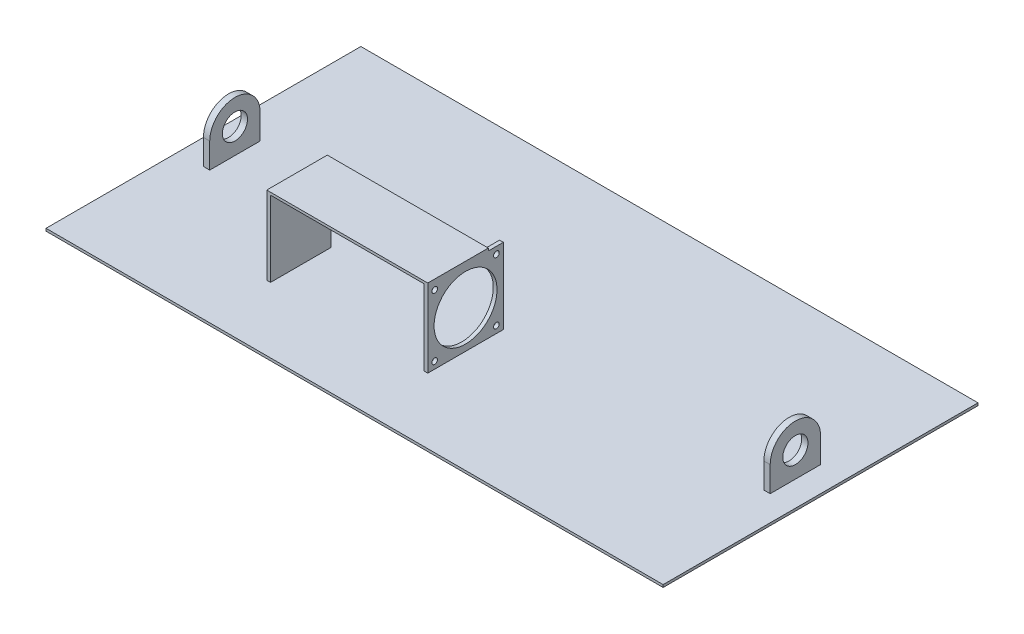
ISO-10303-21;
HEADER;
FILE_DESCRIPTION(('STEP AP214'),'2;1');
FILE_NAME('part.step','',(''),(''),'','','');
FILE_SCHEMA(('AUTOMOTIVE_DESIGN { 1 0 10303 214 1 1 1 1 }'));
ENDSEC;
DATA;
#1=APPLICATION_CONTEXT('core data for automotive mechanical design processes');
#2=APPLICATION_PROTOCOL_DEFINITION('international standard','automotive_design',2000,#1);
#3=PRODUCT_CONTEXT('',#1,'mechanical');
#4=PRODUCT('Part','Part','',(#3));
#5=PRODUCT_RELATED_PRODUCT_CATEGORY('part','',(#4));
#6=PRODUCT_DEFINITION_FORMATION('','',#4);
#7=PRODUCT_DEFINITION_CONTEXT('part definition',#1,'design');
#8=PRODUCT_DEFINITION('design','',#6,#7);
#9=PRODUCT_DEFINITION_SHAPE('','',#8);
#10=(LENGTH_UNIT() NAMED_UNIT(*) SI_UNIT(.MILLI.,.METRE.));
#11=(NAMED_UNIT(*) PLANE_ANGLE_UNIT() SI_UNIT($,.RADIAN.));
#12=(NAMED_UNIT(*) SI_UNIT($,.STERADIAN.) SOLID_ANGLE_UNIT());
#13=UNCERTAINTY_MEASURE_WITH_UNIT(LENGTH_MEASURE(1.E-05),#10,'distance_accuracy_value','');
#14=(GEOMETRIC_REPRESENTATION_CONTEXT(3) GLOBAL_UNCERTAINTY_ASSIGNED_CONTEXT((#13)) GLOBAL_UNIT_ASSIGNED_CONTEXT((#10,
#11,#12)) REPRESENTATION_CONTEXT('',''));
#15=CARTESIAN_POINT('',(0.,0.,0.));
#16=DIRECTION('',(0.,0.,1.));
#17=DIRECTION('',(1.,0.,0.));
#18=AXIS2_PLACEMENT_3D('',#15,#16,#17);
#19=CARTESIAN_POINT('',(0.,62.,0.));
#20=DIRECTION('',(0.,-1.,0.));
#21=DIRECTION('',(0.,0.,-1.));
#22=AXIS2_PLACEMENT_3D('',#19,#20,#21);
#23=PLANE('',#22);
#24=DIRECTION('',(-1.,0.,0.));
#25=VECTOR('',#24,1.);
#26=CARTESIAN_POINT('',(123.35,62.,-100.));
#27=LINE('',#26,#25);
#28=CARTESIAN_POINT('',(251.19,62.,-100.));
#29=VERTEX_POINT('',#28);
#30=CARTESIAN_POINT('',(248.19,62.,-100.));
#31=VERTEX_POINT('',#30);
#32=EDGE_CURVE('E88',#29,#31,#27,.T.);
#33=ORIENTED_EDGE('',*,*,#32,.F.);
#34=DIRECTION('',(0.,0.,-1.));
#35=VECTOR('',#34,1.);
#36=CARTESIAN_POINT('',(251.19,62.,-111.93));
#37=LINE('',#36,#35);
#38=CARTESIAN_POINT('',(251.19,62.,-111.93));
#39=VERTEX_POINT('',#38);
#40=EDGE_CURVE('E305',#29,#39,#37,.T.);
#41=ORIENTED_EDGE('',*,*,#40,.T.);
#42=DIRECTION('',(-1.,0.,0.));
#43=VECTOR('',#42,1.);
#44=CARTESIAN_POINT('',(248.19,62.,-111.93));
#45=LINE('',#44,#43);
#46=CARTESIAN_POINT('',(248.19,62.,-111.93));
#47=VERTEX_POINT('',#46);
#48=EDGE_CURVE('E308',#39,#47,#45,.T.);
#49=ORIENTED_EDGE('',*,*,#48,.T.);
#50=DIRECTION('',(0.,0.,1.));
#51=VECTOR('',#50,1.);
#52=CARTESIAN_POINT('',(248.19,62.,-111.93));
#53=LINE('',#52,#51);
#54=EDGE_CURVE('E303',#47,#31,#53,.T.);
#55=ORIENTED_EDGE('',*,*,#54,.T.);
#56=EDGE_LOOP('',(#33,#41,#49,#55));
#57=FACE_BOUND('',#56,.T.);
#58=ADVANCED_FACE('F72',(#57),#23,.F.);
#59=CARTESIAN_POINT('',(0.,2.,0.));
#60=DIRECTION('',(0.,1.,0.));
#61=DIRECTION('',(0.,0.,1.));
#62=AXIS2_PLACEMENT_3D('',#59,#60,#61);
#63=PLANE('',#62);
#64=DIRECTION('',(-1.,0.,0.));
#65=VECTOR('',#64,1.);
#66=CARTESIAN_POINT('',(20.0000000000001,2.,-105.));
#67=LINE('',#66,#65);
#68=CARTESIAN_POINT('',(25.0000000000001,2.,-105.));
#69=VERTEX_POINT('',#68);
#70=CARTESIAN_POINT('',(20.0000000000001,2.,-105.));
#71=VERTEX_POINT('',#70);
#72=EDGE_CURVE('E342',#69,#71,#67,.T.);
#73=ORIENTED_EDGE('',*,*,#72,.T.);
#74=DIRECTION('',(0.,0.,-1.));
#75=VECTOR('',#74,1.);
#76=CARTESIAN_POINT('',(20.0000000000001,2.,-145.));
#77=LINE('',#76,#75);
#78=CARTESIAN_POINT('',(20.0000000000001,2.,-145.));
#79=VERTEX_POINT('',#78);
#80=EDGE_CURVE('E351',#71,#79,#77,.T.);
#81=ORIENTED_EDGE('',*,*,#80,.T.);
#82=DIRECTION('',(1.,0.,0.));
#83=VECTOR('',#82,1.);
#84=CARTESIAN_POINT('',(20.0000000000001,2.,-145.));
#85=LINE('',#84,#83);
#86=CARTESIAN_POINT('',(25.0000000000001,2.,-145.));
#87=VERTEX_POINT('',#86);
#88=EDGE_CURVE('E348',#79,#87,#85,.T.);
#89=ORIENTED_EDGE('',*,*,#88,.T.);
#90=DIRECTION('',(0.,0.,1.));
#91=VECTOR('',#90,1.);
#92=CARTESIAN_POINT('',(25.0000000000001,2.,-145.));
#93=LINE('',#92,#91);
#94=EDGE_CURVE('E345',#87,#69,#93,.T.);
#95=ORIENTED_EDGE('',*,*,#94,.T.);
#96=EDGE_LOOP('',(#73,#81,#89,#95));
#97=FACE_BOUND('',#96,.T.);
#98=DIRECTION('',(0.,0.,1.));
#99=VECTOR('',#98,1.);
#100=CARTESIAN_POINT('',(0.,2.,-250.));
#101=LINE('',#100,#99);
#102=CARTESIAN_POINT('',(0.,2.,-250.));
#103=VERTEX_POINT('',#102);
#104=CARTESIAN_POINT('',(0.,2.,0.));
#105=VERTEX_POINT('',#104);
#106=EDGE_CURVE('E393',#103,#105,#101,.T.);
#107=ORIENTED_EDGE('',*,*,#106,.T.);
#108=DIRECTION('',(1.,0.,0.));
#109=VECTOR('',#108,1.);
#110=CARTESIAN_POINT('',(0.,2.,0.));
#111=LINE('',#110,#109);
#112=CARTESIAN_POINT('',(490.,2.,0.));
#113=VERTEX_POINT('',#112);
#114=EDGE_CURVE('E396',#105,#113,#111,.T.);
#115=ORIENTED_EDGE('',*,*,#114,.T.);
#116=DIRECTION('',(0.,0.,-1.));
#117=VECTOR('',#116,1.);
#118=CARTESIAN_POINT('',(490.,2.,0.));
#119=LINE('',#118,#117);
#120=CARTESIAN_POINT('',(490.,2.,-250.));
#121=VERTEX_POINT('',#120);
#122=EDGE_CURVE('E399',#113,#121,#119,.T.);
#123=ORIENTED_EDGE('',*,*,#122,.T.);
#124=DIRECTION('',(-1.,0.,0.));
#125=VECTOR('',#124,1.);
#126=CARTESIAN_POINT('',(490.,2.,-250.));
#127=LINE('',#126,#125);
#128=EDGE_CURVE('E401',#121,#103,#127,.T.);
#129=ORIENTED_EDGE('',*,*,#128,.T.);
#130=EDGE_LOOP('',(#107,#115,#123,#129));
#131=FACE_BOUND('',#130,.T.);
#132=DIRECTION('',(0.,0.,-1.));
#133=VECTOR('',#132,1.);
#134=CARTESIAN_POINT('',(470.,2.,-145.));
#135=LINE('',#134,#133);
#136=CARTESIAN_POINT('',(470.,2.,-105.));
#137=VERTEX_POINT('',#136);
#138=CARTESIAN_POINT('',(470.,2.,-145.));
#139=VERTEX_POINT('',#138);
#140=EDGE_CURVE('E375',#137,#139,#135,.T.);
#141=ORIENTED_EDGE('',*,*,#140,.F.);
#142=DIRECTION('',(1.,0.,0.));
#143=VECTOR('',#142,1.);
#144=CARTESIAN_POINT('',(470.,2.,-105.));
#145=LINE('',#144,#143);
#146=CARTESIAN_POINT('',(465.,2.,-105.));
#147=VERTEX_POINT('',#146);
#148=EDGE_CURVE('E372',#147,#137,#145,.T.);
#149=ORIENTED_EDGE('',*,*,#148,.F.);
#150=DIRECTION('',(0.,0.,1.));
#151=VECTOR('',#150,1.);
#152=CARTESIAN_POINT('',(465.,2.,-145.));
#153=LINE('',#152,#151);
#154=CARTESIAN_POINT('',(465.,2.,-145.));
#155=VERTEX_POINT('',#154);
#156=EDGE_CURVE('E381',#155,#147,#153,.T.);
#157=ORIENTED_EDGE('',*,*,#156,.F.);
#158=DIRECTION('',(-1.,0.,0.));
#159=VECTOR('',#158,1.);
#160=CARTESIAN_POINT('',(470.,2.,-145.));
#161=LINE('',#160,#159);
#162=EDGE_CURVE('E378',#139,#155,#161,.T.);
#163=ORIENTED_EDGE('',*,*,#162,.F.);
#164=EDGE_LOOP('',(#141,#149,#157,#163));
#165=FACE_BOUND('',#164,.T.);
#166=DIRECTION('',(1.,0.,0.));
#167=VECTOR('',#166,1.);
#168=CARTESIAN_POINT('',(251.19,2.,-51.93));
#169=LINE('',#168,#167);
#170=CARTESIAN_POINT('',(248.19,2.,-51.93));
#171=VERTEX_POINT('',#170);
#172=CARTESIAN_POINT('',(251.19,2.,-51.93));
#173=VERTEX_POINT('',#172);
#174=EDGE_CURVE('E313',#171,#173,#169,.T.);
#175=ORIENTED_EDGE('',*,*,#174,.F.);
#176=DIRECTION('',(0.,0.,1.));
#177=VECTOR('',#176,1.);
#178=CARTESIAN_POINT('',(248.19,2.,-111.93));
#179=LINE('',#178,#177);
#180=CARTESIAN_POINT('',(248.19,2.,-111.93));
#181=VERTEX_POINT('',#180);
#182=EDGE_CURVE('E300',#181,#171,#179,.T.);
#183=ORIENTED_EDGE('',*,*,#182,.F.);
#184=DIRECTION('',(-1.,0.,0.));
#185=VECTOR('',#184,1.);
#186=CARTESIAN_POINT('',(248.19,2.,-111.93));
#187=LINE('',#186,#185);
#188=CARTESIAN_POINT('',(251.19,2.,-111.93));
#189=VERTEX_POINT('',#188);
#190=EDGE_CURVE('E306',#189,#181,#187,.T.);
#191=ORIENTED_EDGE('',*,*,#190,.F.);
#192=DIRECTION('',(0.,0.,-1.));
#193=VECTOR('',#192,1.);
#194=CARTESIAN_POINT('',(251.19,2.,-111.93));
#195=LINE('',#194,#193);
#196=EDGE_CURVE('E315',#173,#189,#195,.T.);
#197=ORIENTED_EDGE('',*,*,#196,.F.);
#198=EDGE_LOOP('',(#175,#183,#191,#197));
#199=FACE_BOUND('',#198,.T.);
#200=DIRECTION('',(1.,0.,0.));
#201=VECTOR('',#200,1.);
#202=CARTESIAN_POINT('',(126.35,2.,-51.93));
#203=LINE('',#202,#201);
#204=CARTESIAN_POINT('',(123.35,2.,-51.93));
#205=VERTEX_POINT('',#204);
#206=CARTESIAN_POINT('',(126.35,2.,-51.93));
#207=VERTEX_POINT('',#206);
#208=EDGE_CURVE('E264',#205,#207,#203,.T.);
#209=ORIENTED_EDGE('',*,*,#208,.F.);
#210=DIRECTION('',(0.,0.,1.));
#211=VECTOR('',#210,1.);
#212=CARTESIAN_POINT('',(123.35,2.,-51.93));
#213=LINE('',#212,#211);
#214=CARTESIAN_POINT('',(123.35,2.,-100.));
#215=VERTEX_POINT('',#214);
#216=EDGE_CURVE('E226',#215,#205,#213,.T.);
#217=ORIENTED_EDGE('',*,*,#216,.F.);
#218=DIRECTION('',(-1.,0.,0.));
#219=VECTOR('',#218,1.);
#220=CARTESIAN_POINT('',(123.35,2.,-100.));
#221=LINE('',#220,#219);
#222=CARTESIAN_POINT('',(126.35,2.,-100.));
#223=VERTEX_POINT('',#222);
#224=EDGE_CURVE('E262',#223,#215,#221,.T.);
#225=ORIENTED_EDGE('',*,*,#224,.F.);
#226=DIRECTION('',(0.,0.,-1.));
#227=VECTOR('',#226,1.);
#228=CARTESIAN_POINT('',(126.35,2.,-100.));
#229=LINE('',#228,#227);
#230=EDGE_CURVE('E266',#207,#223,#229,.T.);
#231=ORIENTED_EDGE('',*,*,#230,.F.);
#232=EDGE_LOOP('',(#209,#217,#225,#231));
#233=FACE_BOUND('',#232,.T.);
#234=ADVANCED_FACE('F440',(#97,#131,#165,#199,#233),#63,.T.);
#235=CARTESIAN_POINT('',(20.0000000000001,42.,-145.));
#236=DIRECTION('',(0.,0.,-1.));
#237=DIRECTION('',(-1.,0.,0.));
#238=AXIS2_PLACEMENT_3D('',#235,#236,#237);
#239=PLANE('',#238);
#240=DIRECTION('',(0.,-1.,0.));
#241=VECTOR('',#240,1.);
#242=CARTESIAN_POINT('',(20.0000000000001,42.,-145.));
#243=LINE('',#242,#241);
#244=CARTESIAN_POINT('',(20.0000000000001,22.,-145.));
#245=VERTEX_POINT('',#244);
#246=EDGE_CURVE('E356',#245,#79,#243,.T.);
#247=ORIENTED_EDGE('',*,*,#246,.F.);
#248=DIRECTION('',(-1.,0.,0.));
#249=VECTOR('',#248,1.);
#250=CARTESIAN_POINT('',(60.0000000000001,22.,-145.));
#251=LINE('',#250,#249);
#252=CARTESIAN_POINT('',(25.0000000000001,22.,-145.));
#253=VERTEX_POINT('',#252);
#254=EDGE_CURVE('E332',#253,#245,#251,.T.);
#255=ORIENTED_EDGE('',*,*,#254,.F.);
#256=DIRECTION('',(0.,-1.,0.));
#257=VECTOR('',#256,1.);
#258=CARTESIAN_POINT('',(25.0000000000001,42.,-145.));
#259=LINE('',#258,#257);
#260=EDGE_CURVE('E358',#253,#87,#259,.T.);
#261=ORIENTED_EDGE('',*,*,#260,.T.);
#262=ORIENTED_EDGE('',*,*,#88,.F.);
#263=EDGE_LOOP('',(#247,#255,#261,#262));
#264=FACE_BOUND('',#263,.T.);
#265=ADVANCED_FACE('F443',(#264),#239,.T.);
#266=CARTESIAN_POINT('',(470.,42.,-145.));
#267=DIRECTION('',(-1.,0.,0.));
#268=DIRECTION('',(0.,0.,1.));
#269=AXIS2_PLACEMENT_3D('',#266,#267,#268);
#270=PLANE('',#269);
#271=CARTESIAN_POINT('',(470.,22.,-125.));
#272=DIRECTION('',(1.,0.,0.));
#273=DIRECTION('',(0.,0.,-1.));
#274=AXIS2_PLACEMENT_3D('',#271,#272,#273);
#275=CIRCLE('',#274,9.99999999999997);
#276=CARTESIAN_POINT('',(470.,22.,-135.));
#277=VERTEX_POINT('',#276);
#278=EDGE_CURVE('E362',#277,#277,#275,.T.);
#279=ORIENTED_EDGE('',*,*,#278,.F.);
#280=EDGE_LOOP('',(#279));
#281=FACE_BOUND('',#280,.T.);
#282=DIRECTION('',(0.,-1.,0.));
#283=VECTOR('',#282,1.);
#284=CARTESIAN_POINT('',(470.,42.,-145.));
#285=LINE('',#284,#283);
#286=CARTESIAN_POINT('',(470.,22.,-145.));
#287=VERTEX_POINT('',#286);
#288=EDGE_CURVE('E388',#287,#139,#285,.T.);
#289=ORIENTED_EDGE('',*,*,#288,.F.);
#290=CARTESIAN_POINT('',(470.,22.,-125.));
#291=DIRECTION('',(1.,0.,0.));
#292=DIRECTION('',(0.,0.,-1.));
#293=AXIS2_PLACEMENT_3D('',#290,#291,#292);
#294=CIRCLE('',#293,20.);
#295=CARTESIAN_POINT('',(470.,22.,-105.));
#296=VERTEX_POINT('',#295);
#297=EDGE_CURVE('E365',#287,#296,#294,.T.);
#298=ORIENTED_EDGE('',*,*,#297,.T.);
#299=DIRECTION('',(0.,-1.,0.));
#300=VECTOR('',#299,1.);
#301=CARTESIAN_POINT('',(470.,42.,-105.));
#302=LINE('',#301,#300);
#303=EDGE_CURVE('E390',#296,#137,#302,.T.);
#304=ORIENTED_EDGE('',*,*,#303,.T.);
#305=ORIENTED_EDGE('',*,*,#140,.T.);
#306=EDGE_LOOP('',(#289,#298,#304,#305));
#307=FACE_BOUND('',#306,.T.);
#308=ADVANCED_FACE('F520',(#281,#307),#270,.F.);
#309=CARTESIAN_POINT('',(465.,42.,-145.));
#310=DIRECTION('',(1.,0.,0.));
#311=DIRECTION('',(0.,0.,-1.));
#312=AXIS2_PLACEMENT_3D('',#309,#310,#311);
#313=PLANE('',#312);
#314=CARTESIAN_POINT('',(465.,22.,-125.));
#315=DIRECTION('',(1.,0.,0.));
#316=DIRECTION('',(0.,0.,-1.));
#317=AXIS2_PLACEMENT_3D('',#314,#315,#316);
#318=CIRCLE('',#317,9.99999999999997);
#319=CARTESIAN_POINT('',(465.,22.,-135.));
#320=VERTEX_POINT('',#319);
#321=EDGE_CURVE('E76',#320,#320,#318,.T.);
#322=ORIENTED_EDGE('',*,*,#321,.T.);
#323=EDGE_LOOP('',(#322));
#324=FACE_BOUND('',#323,.T.);
#325=CARTESIAN_POINT('',(465.,22.,-125.));
#326=DIRECTION('',(1.,0.,0.));
#327=DIRECTION('',(0.,0.,-1.));
#328=AXIS2_PLACEMENT_3D('',#325,#326,#327);
#329=CIRCLE('',#328,20.);
#330=CARTESIAN_POINT('',(465.,22.,-145.));
#331=VERTEX_POINT('',#330);
#332=CARTESIAN_POINT('',(465.,22.,-105.));
#333=VERTEX_POINT('',#332);
#334=EDGE_CURVE('E370',#331,#333,#329,.T.);
#335=ORIENTED_EDGE('',*,*,#334,.F.);
#336=DIRECTION('',(0.,-1.,0.));
#337=VECTOR('',#336,1.);
#338=CARTESIAN_POINT('',(465.,42.,-145.));
#339=LINE('',#338,#337);
#340=EDGE_CURVE('E386',#331,#155,#339,.T.);
#341=ORIENTED_EDGE('',*,*,#340,.T.);
#342=ORIENTED_EDGE('',*,*,#156,.T.);
#343=DIRECTION('',(0.,-1.,0.));
#344=VECTOR('',#343,1.);
#345=CARTESIAN_POINT('',(465.,42.,-105.));
#346=LINE('',#345,#344);
#347=EDGE_CURVE('E384',#333,#147,#346,.T.);
#348=ORIENTED_EDGE('',*,*,#347,.F.);
#349=EDGE_LOOP('',(#335,#341,#342,#348));
#350=FACE_BOUND('',#349,.T.);
#351=ADVANCED_FACE('F538',(#324,#350),#313,.F.);
#352=CARTESIAN_POINT('',(470.,42.,-105.));
#353=DIRECTION('',(0.,0.,-1.));
#354=DIRECTION('',(-1.,0.,0.));
#355=AXIS2_PLACEMENT_3D('',#352,#353,#354);
#356=PLANE('',#355);
#357=DIRECTION('',(1.,0.,0.));
#358=VECTOR('',#357,1.);
#359=CARTESIAN_POINT('',(430.,22.,-105.));
#360=LINE('',#359,#358);
#361=EDGE_CURVE('E368',#333,#296,#360,.T.);
#362=ORIENTED_EDGE('',*,*,#361,.F.);
#363=ORIENTED_EDGE('',*,*,#347,.T.);
#364=ORIENTED_EDGE('',*,*,#148,.T.);
#365=ORIENTED_EDGE('',*,*,#303,.F.);
#366=EDGE_LOOP('',(#362,#363,#364,#365));
#367=FACE_BOUND('',#366,.T.);
#368=ADVANCED_FACE('F541',(#367),#356,.F.);
#369=CARTESIAN_POINT('',(0.,2.,-250.));
#370=DIRECTION('',(1.,0.,0.));
#371=DIRECTION('',(0.,0.,-1.));
#372=AXIS2_PLACEMENT_3D('',#369,#370,#371);
#373=PLANE('',#372);
#374=DIRECTION('',(0.,0.,1.));
#375=VECTOR('',#374,1.);
#376=CARTESIAN_POINT('',(0.,0.,-250.));
#377=LINE('',#376,#375);
#378=CARTESIAN_POINT('',(0.,0.,-250.));
#379=VERTEX_POINT('',#378);
#380=CARTESIAN_POINT('',(0.,0.,0.));
#381=VERTEX_POINT('',#380);
#382=EDGE_CURVE('E392',#379,#381,#377,.T.);
#383=ORIENTED_EDGE('',*,*,#382,.T.);
#384=DIRECTION('',(0.,-1.,0.));
#385=VECTOR('',#384,1.);
#386=CARTESIAN_POINT('',(0.,2.,0.));
#387=LINE('',#386,#385);
#388=EDGE_CURVE('E81',#105,#381,#387,.T.);
#389=ORIENTED_EDGE('',*,*,#388,.F.);
#390=ORIENTED_EDGE('',*,*,#106,.F.);
#391=DIRECTION('',(0.,-1.,0.));
#392=VECTOR('',#391,1.);
#393=CARTESIAN_POINT('',(0.,2.,-250.));
#394=LINE('',#393,#392);
#395=EDGE_CURVE('E403',#103,#379,#394,.T.);
#396=ORIENTED_EDGE('',*,*,#395,.T.);
#397=EDGE_LOOP('',(#383,#389,#390,#396));
#398=FACE_BOUND('',#397,.T.);
#399=ADVANCED_FACE('F74',(#398),#373,.F.);
#400=CARTESIAN_POINT('',(0.,2.,0.));
#401=DIRECTION('',(0.,0.,-1.));
#402=DIRECTION('',(-1.,0.,0.));
#403=AXIS2_PLACEMENT_3D('',#400,#401,#402);
#404=PLANE('',#403);
#405=DIRECTION('',(1.,0.,0.));
#406=VECTOR('',#405,1.);
#407=CARTESIAN_POINT('',(0.,0.,0.));
#408=LINE('',#407,#406);
#409=CARTESIAN_POINT('',(490.,0.,0.));
#410=VERTEX_POINT('',#409);
#411=EDGE_CURVE('E406',#381,#410,#408,.T.);
#412=ORIENTED_EDGE('',*,*,#411,.T.);
#413=DIRECTION('',(0.,-1.,0.));
#414=VECTOR('',#413,1.);
#415=CARTESIAN_POINT('',(490.,2.,0.));
#416=LINE('',#415,#414);
#417=EDGE_CURVE('E416',#113,#410,#416,.T.);
#418=ORIENTED_EDGE('',*,*,#417,.F.);
#419=ORIENTED_EDGE('',*,*,#114,.F.);
#420=ORIENTED_EDGE('',*,*,#388,.T.);
#421=EDGE_LOOP('',(#412,#418,#419,#420));
#422=FACE_BOUND('',#421,.T.);
#423=ADVANCED_FACE('F422',(#422),#404,.F.);
#424=CARTESIAN_POINT('',(490.,2.,0.));
#425=DIRECTION('',(-1.,0.,0.));
#426=DIRECTION('',(0.,0.,1.));
#427=AXIS2_PLACEMENT_3D('',#424,#425,#426);
#428=PLANE('',#427);
#429=DIRECTION('',(0.,0.,-1.));
#430=VECTOR('',#429,1.);
#431=CARTESIAN_POINT('',(490.,0.,0.));
#432=LINE('',#431,#430);
#433=CARTESIAN_POINT('',(490.,0.,-250.));
#434=VERTEX_POINT('',#433);
#435=EDGE_CURVE('E408',#410,#434,#432,.T.);
#436=ORIENTED_EDGE('',*,*,#435,.T.);
#437=DIRECTION('',(0.,-1.,0.));
#438=VECTOR('',#437,1.);
#439=CARTESIAN_POINT('',(490.,2.,-250.));
#440=LINE('',#439,#438);
#441=EDGE_CURVE('E413',#121,#434,#440,.T.);
#442=ORIENTED_EDGE('',*,*,#441,.F.);
#443=ORIENTED_EDGE('',*,*,#122,.F.);
#444=ORIENTED_EDGE('',*,*,#417,.T.);
#445=EDGE_LOOP('',(#436,#442,#443,#444));
#446=FACE_BOUND('',#445,.T.);
#447=ADVANCED_FACE('F434',(#446),#428,.F.);
#448=CARTESIAN_POINT('',(490.,2.,-250.));
#449=DIRECTION('',(0.,0.,1.));
#450=DIRECTION('',(1.,0.,0.));
#451=AXIS2_PLACEMENT_3D('',#448,#449,#450);
#452=PLANE('',#451);
#453=DIRECTION('',(-1.,0.,0.));
#454=VECTOR('',#453,1.);
#455=CARTESIAN_POINT('',(490.,0.,-250.));
#456=LINE('',#455,#454);
#457=EDGE_CURVE('E397',#434,#379,#456,.T.);
#458=ORIENTED_EDGE('',*,*,#457,.T.);
#459=ORIENTED_EDGE('',*,*,#395,.F.);
#460=ORIENTED_EDGE('',*,*,#128,.F.);
#461=ORIENTED_EDGE('',*,*,#441,.T.);
#462=EDGE_LOOP('',(#458,#459,#460,#461));
#463=FACE_BOUND('',#462,.T.);
#464=ADVANCED_FACE('F438',(#463),#452,.F.);
#465=CARTESIAN_POINT('',(0.,0.,0.));
#466=DIRECTION('',(0.,1.,0.));
#467=DIRECTION('',(0.,0.,1.));
#468=AXIS2_PLACEMENT_3D('',#465,#466,#467);
#469=PLANE('',#468);
#470=ORIENTED_EDGE('',*,*,#382,.F.);
#471=ORIENTED_EDGE('',*,*,#457,.F.);
#472=ORIENTED_EDGE('',*,*,#435,.F.);
#473=ORIENTED_EDGE('',*,*,#411,.F.);
#474=EDGE_LOOP('',(#470,#471,#472,#473));
#475=FACE_BOUND('',#474,.T.);
#476=ADVANCED_FACE('F430',(#475),#469,.F.);
#477=CARTESIAN_POINT('',(470.,42.,-145.));
#478=DIRECTION('',(0.,0.,1.));
#479=DIRECTION('',(1.,0.,0.));
#480=AXIS2_PLACEMENT_3D('',#477,#478,#479);
#481=PLANE('',#480);
#482=ORIENTED_EDGE('',*,*,#340,.F.);
#483=DIRECTION('',(1.,0.,0.));
#484=VECTOR('',#483,1.);
#485=CARTESIAN_POINT('',(430.,22.,-145.));
#486=LINE('',#485,#484);
#487=EDGE_CURVE('E12',#331,#287,#486,.T.);
#488=ORIENTED_EDGE('',*,*,#487,.T.);
#489=ORIENTED_EDGE('',*,*,#288,.T.);
#490=ORIENTED_EDGE('',*,*,#162,.T.);
#491=EDGE_LOOP('',(#482,#488,#489,#490));
#492=FACE_BOUND('',#491,.T.);
#493=ADVANCED_FACE('F536',(#492),#481,.F.);
#494=CARTESIAN_POINT('',(430.,22.,-125.));
#495=DIRECTION('',(1.,0.,0.));
#496=DIRECTION('',(0.,0.,-1.));
#497=AXIS2_PLACEMENT_3D('',#494,#495,#496);
#498=CYLINDRICAL_SURFACE('',#497,20.);
#499=ORIENTED_EDGE('',*,*,#334,.T.);
#500=ORIENTED_EDGE('',*,*,#361,.T.);
#501=ORIENTED_EDGE('',*,*,#297,.F.);
#502=ORIENTED_EDGE('',*,*,#487,.F.);
#503=EDGE_LOOP('',(#499,#500,#501,#502));
#504=FACE_BOUND('',#503,.T.);
#505=ADVANCED_FACE('F532',(#504),#498,.T.);
#506=CARTESIAN_POINT('',(430.,22.,-125.));
#507=DIRECTION('',(1.,0.,0.));
#508=DIRECTION('',(0.,0.,-1.));
#509=AXIS2_PLACEMENT_3D('',#506,#507,#508);
#510=CYLINDRICAL_SURFACE('',#509,9.99999999999997);
#511=ORIENTED_EDGE('',*,*,#278,.T.);
#512=EDGE_LOOP('',(#511));
#513=FACE_BOUND('',#512,.T.);
#514=ORIENTED_EDGE('',*,*,#321,.F.);
#515=EDGE_LOOP('',(#514));
#516=FACE_BOUND('',#515,.T.);
#517=ADVANCED_FACE('F528',(#513,#516),#510,.F.);
#518=CARTESIAN_POINT('',(20.0000000000001,42.,-105.));
#519=DIRECTION('',(0.,0.,1.));
#520=DIRECTION('',(1.,0.,0.));
#521=AXIS2_PLACEMENT_3D('',#518,#519,#520);
#522=PLANE('',#521);
#523=DIRECTION('',(-1.,0.,0.));
#524=VECTOR('',#523,1.);
#525=CARTESIAN_POINT('',(60.0000000000001,22.,-105.));
#526=LINE('',#525,#524);
#527=CARTESIAN_POINT('',(25.0000000000001,22.,-105.));
#528=VERTEX_POINT('',#527);
#529=CARTESIAN_POINT('',(20.0000000000001,22.,-105.));
#530=VERTEX_POINT('',#529);
#531=EDGE_CURVE('E337',#528,#530,#526,.T.);
#532=ORIENTED_EDGE('',*,*,#531,.T.);
#533=DIRECTION('',(0.,-1.,0.));
#534=VECTOR('',#533,1.);
#535=CARTESIAN_POINT('',(20.0000000000001,42.,-105.));
#536=LINE('',#535,#534);
#537=EDGE_CURVE('E354',#530,#71,#536,.T.);
#538=ORIENTED_EDGE('',*,*,#537,.T.);
#539=ORIENTED_EDGE('',*,*,#72,.F.);
#540=DIRECTION('',(0.,-1.,0.));
#541=VECTOR('',#540,1.);
#542=CARTESIAN_POINT('',(25.0000000000001,42.,-105.));
#543=LINE('',#542,#541);
#544=EDGE_CURVE('E360',#528,#69,#543,.T.);
#545=ORIENTED_EDGE('',*,*,#544,.F.);
#546=EDGE_LOOP('',(#532,#538,#539,#545));
#547=FACE_BOUND('',#546,.T.);
#548=ADVANCED_FACE('F524',(#547),#522,.T.);
#549=CARTESIAN_POINT('',(25.0000000000001,42.,-145.));
#550=DIRECTION('',(1.,0.,0.));
#551=DIRECTION('',(0.,0.,-1.));
#552=AXIS2_PLACEMENT_3D('',#549,#550,#551);
#553=PLANE('',#552);
#554=CARTESIAN_POINT('',(25.0000000000001,22.,-125.));
#555=DIRECTION('',(1.,0.,0.));
#556=DIRECTION('',(0.,0.,-1.));
#557=AXIS2_PLACEMENT_3D('',#554,#555,#556);
#558=CIRCLE('',#557,9.99999999999997);
#559=CARTESIAN_POINT('',(25.0000000000001,22.,-135.));
#560=VERTEX_POINT('',#559);
#561=EDGE_CURVE('E329',#560,#560,#558,.F.);
#562=ORIENTED_EDGE('',*,*,#561,.T.);
#563=EDGE_LOOP('',(#562));
#564=FACE_BOUND('',#563,.T.);
#565=ORIENTED_EDGE('',*,*,#260,.F.);
#566=CARTESIAN_POINT('',(25.0000000000001,22.,-125.));
#567=DIRECTION('',(1.,0.,0.));
#568=DIRECTION('',(0.,0.,-1.));
#569=AXIS2_PLACEMENT_3D('',#566,#567,#568);
#570=CIRCLE('',#569,20.);
#571=EDGE_CURVE('E340',#528,#253,#570,.F.);
#572=ORIENTED_EDGE('',*,*,#571,.F.);
#573=ORIENTED_EDGE('',*,*,#544,.T.);
#574=ORIENTED_EDGE('',*,*,#94,.F.);
#575=EDGE_LOOP('',(#565,#572,#573,#574));
#576=FACE_BOUND('',#575,.T.);
#577=ADVANCED_FACE('F516',(#564,#576),#553,.T.);
#578=CARTESIAN_POINT('',(20.0000000000001,42.,-145.));
#579=DIRECTION('',(-1.,0.,0.));
#580=DIRECTION('',(0.,0.,1.));
#581=AXIS2_PLACEMENT_3D('',#578,#579,#580);
#582=PLANE('',#581);
#583=CARTESIAN_POINT('',(20.0000000000001,22.,-125.));
#584=DIRECTION('',(1.,0.,0.));
#585=DIRECTION('',(0.,0.,-1.));
#586=AXIS2_PLACEMENT_3D('',#583,#584,#585);
#587=CIRCLE('',#586,9.99999999999997);
#588=CARTESIAN_POINT('',(20.0000000000001,22.,-135.));
#589=VERTEX_POINT('',#588);
#590=EDGE_CURVE('E326',#589,#589,#587,.T.);
#591=ORIENTED_EDGE('',*,*,#590,.T.);
#592=EDGE_LOOP('',(#591));
#593=FACE_BOUND('',#592,.T.);
#594=CARTESIAN_POINT('',(20.0000000000001,22.,-125.));
#595=DIRECTION('',(1.,0.,0.));
#596=DIRECTION('',(0.,0.,-1.));
#597=AXIS2_PLACEMENT_3D('',#594,#595,#596);
#598=CIRCLE('',#597,20.);
#599=EDGE_CURVE('E335',#245,#530,#598,.T.);
#600=ORIENTED_EDGE('',*,*,#599,.F.);
#601=ORIENTED_EDGE('',*,*,#246,.T.);
#602=ORIENTED_EDGE('',*,*,#80,.F.);
#603=ORIENTED_EDGE('',*,*,#537,.F.);
#604=EDGE_LOOP('',(#600,#601,#602,#603));
#605=FACE_BOUND('',#604,.T.);
#606=ADVANCED_FACE('F512',(#593,#605),#582,.T.);
#607=CARTESIAN_POINT('',(60.0000000000001,22.,-125.));
#608=DIRECTION('',(-1.,0.,0.));
#609=DIRECTION('',(0.,0.,1.));
#610=AXIS2_PLACEMENT_3D('',#607,#608,#609);
#611=CYLINDRICAL_SURFACE('',#610,20.);
#612=ORIENTED_EDGE('',*,*,#571,.T.);
#613=ORIENTED_EDGE('',*,*,#254,.T.);
#614=ORIENTED_EDGE('',*,*,#599,.T.);
#615=ORIENTED_EDGE('',*,*,#531,.F.);
#616=EDGE_LOOP('',(#612,#613,#614,#615));
#617=FACE_BOUND('',#616,.T.);
#618=ADVANCED_FACE('F508',(#617),#611,.T.);
#619=CARTESIAN_POINT('',(60.0000000000001,22.,-125.));
#620=DIRECTION('',(-1.,0.,0.));
#621=DIRECTION('',(0.,0.,1.));
#622=AXIS2_PLACEMENT_3D('',#619,#620,#621);
#623=CYLINDRICAL_SURFACE('',#622,9.99999999999997);
#624=ORIENTED_EDGE('',*,*,#561,.F.);
#625=EDGE_LOOP('',(#624));
#626=FACE_BOUND('',#625,.T.);
#627=ORIENTED_EDGE('',*,*,#590,.F.);
#628=EDGE_LOOP('',(#627));
#629=FACE_BOUND('',#628,.T.);
#630=ADVANCED_FACE('F504',(#626,#629),#623,.F.);
#631=CARTESIAN_POINT('',(248.19,62.,-111.93));
#632=DIRECTION('',(1.,0.,0.));
#633=DIRECTION('',(0.,0.,-1.));
#634=AXIS2_PLACEMENT_3D('',#631,#632,#633);
#635=PLANE('',#634);
#636=CARTESIAN_POINT('',(248.19,56.5,-106.43));
#637=DIRECTION('',(-1.,0.,0.));
#638=DIRECTION('',(0.,0.,-1.));
#639=AXIS2_PLACEMENT_3D('',#636,#637,#638);
#640=CIRCLE('',#639,2.25000000000001);
#641=CARTESIAN_POINT('',(248.19,56.5,-108.68));
#642=VERTEX_POINT('',#641);
#643=EDGE_CURVE('E229',#642,#642,#640,.T.);
#644=ORIENTED_EDGE('',*,*,#643,.F.);
#645=EDGE_LOOP('',(#644));
#646=FACE_BOUND('',#645,.T.);
#647=CARTESIAN_POINT('',(248.19,7.50000000000005,-106.43));
#648=DIRECTION('',(-1.,0.,0.));
#649=DIRECTION('',(0.,0.,1.));
#650=AXIS2_PLACEMENT_3D('',#647,#648,#649);
#651=CIRCLE('',#650,2.25000000000001);
#652=CARTESIAN_POINT('',(248.19,7.50000000000005,-104.18));
#653=VERTEX_POINT('',#652);
#654=EDGE_CURVE('E281',#653,#653,#651,.T.);
#655=ORIENTED_EDGE('',*,*,#654,.F.);
#656=EDGE_LOOP('',(#655));
#657=FACE_BOUND('',#656,.T.);
#658=CARTESIAN_POINT('',(248.19,7.49999999999999,-57.43));
#659=DIRECTION('',(-1.,0.,0.));
#660=DIRECTION('',(0.,0.,-1.));
#661=AXIS2_PLACEMENT_3D('',#658,#659,#660);
#662=CIRCLE('',#661,2.25);
#663=CARTESIAN_POINT('',(248.19,7.49999999999999,-59.68));
#664=VERTEX_POINT('',#663);
#665=EDGE_CURVE('E273',#664,#664,#662,.T.);
#666=ORIENTED_EDGE('',*,*,#665,.F.);
#667=EDGE_LOOP('',(#666));
#668=FACE_BOUND('',#667,.T.);
#669=CARTESIAN_POINT('',(248.19,56.5,-57.43));
#670=DIRECTION('',(-1.,0.,0.));
#671=DIRECTION('',(0.,0.,1.));
#672=AXIS2_PLACEMENT_3D('',#669,#670,#671);
#673=CIRCLE('',#672,2.25);
#674=CARTESIAN_POINT('',(248.19,56.5,-55.18));
#675=VERTEX_POINT('',#674);
#676=EDGE_CURVE('E280',#675,#675,#673,.T.);
#677=ORIENTED_EDGE('',*,*,#676,.F.);
#678=EDGE_LOOP('',(#677));
#679=FACE_BOUND('',#678,.T.);
#680=CARTESIAN_POINT('',(248.19,32.,-81.93));
#681=DIRECTION('',(-1.,0.,0.));
#682=DIRECTION('',(0.,0.,1.));
#683=AXIS2_PLACEMENT_3D('',#680,#681,#682);
#684=CIRCLE('',#683,25.);
#685=CARTESIAN_POINT('',(248.19,32.,-56.93));
#686=VERTEX_POINT('',#685);
#687=EDGE_CURVE('E296',#686,#686,#684,.T.);
#688=ORIENTED_EDGE('',*,*,#687,.F.);
#689=EDGE_LOOP('',(#688));
#690=FACE_BOUND('',#689,.T.);
#691=ORIENTED_EDGE('',*,*,#182,.T.);
#692=DIRECTION('',(0.,-1.,0.));
#693=VECTOR('',#692,1.);
#694=CARTESIAN_POINT('',(248.19,62.,-51.93));
#695=LINE('',#694,#693);
#696=CARTESIAN_POINT('',(248.19,62.,-51.93));
#697=VERTEX_POINT('',#696);
#698=EDGE_CURVE('E324',#697,#171,#695,.T.);
#699=ORIENTED_EDGE('',*,*,#698,.F.);
#700=EDGE_CURVE('E257',#31,#697,#53,.T.);
#701=ORIENTED_EDGE('',*,*,#700,.F.);
#702=ORIENTED_EDGE('',*,*,#54,.F.);
#703=DIRECTION('',(0.,-1.,0.));
#704=VECTOR('',#703,1.);
#705=CARTESIAN_POINT('',(248.19,62.,-111.93));
#706=LINE('',#705,#704);
#707=EDGE_CURVE('E310',#47,#181,#706,.T.);
#708=ORIENTED_EDGE('',*,*,#707,.T.);
#709=EDGE_LOOP('',(#691,#699,#701,#702,#708));
#710=FACE_BOUND('',#709,.T.);
#711=ADVANCED_FACE('F466',(#646,#657,#668,#679,#690,#710),#635,.F.);
#712=CARTESIAN_POINT('',(251.19,62.,-51.93));
#713=DIRECTION('',(0.,0.,-1.));
#714=DIRECTION('',(-1.,0.,0.));
#715=AXIS2_PLACEMENT_3D('',#712,#713,#714);
#716=PLANE('',#715);
#717=ORIENTED_EDGE('',*,*,#174,.T.);
#718=DIRECTION('',(0.,-1.,0.));
#719=VECTOR('',#718,1.);
#720=CARTESIAN_POINT('',(251.19,62.,-51.93));
#721=LINE('',#720,#719);
#722=CARTESIAN_POINT('',(251.19,64.,-51.93));
#723=VERTEX_POINT('',#722);
#724=EDGE_CURVE('E236',#723,#173,#721,.T.);
#725=ORIENTED_EDGE('',*,*,#724,.F.);
#726=DIRECTION('',(1.,0.,0.));
#727=VECTOR('',#726,1.);
#728=CARTESIAN_POINT('',(251.19,64.,-51.93));
#729=LINE('',#728,#727);
#730=CARTESIAN_POINT('',(123.35,64.,-51.93));
#731=VERTEX_POINT('',#730);
#732=EDGE_CURVE('E233',#731,#723,#729,.T.);
#733=ORIENTED_EDGE('',*,*,#732,.F.);
#734=DIRECTION('',(0.,-1.,0.));
#735=VECTOR('',#734,1.);
#736=CARTESIAN_POINT('',(123.35,62.,-51.93));
#737=LINE('',#736,#735);
#738=EDGE_CURVE('E219',#731,#205,#737,.T.);
#739=ORIENTED_EDGE('',*,*,#738,.T.);
#740=ORIENTED_EDGE('',*,*,#208,.T.);
#741=DIRECTION('',(0.,-1.,0.));
#742=VECTOR('',#741,1.);
#743=CARTESIAN_POINT('',(126.35,62.,-51.93));
#744=LINE('',#743,#742);
#745=CARTESIAN_POINT('',(126.35,62.,-51.93));
#746=VERTEX_POINT('',#745);
#747=EDGE_CURVE('E230',#746,#207,#744,.T.);
#748=ORIENTED_EDGE('',*,*,#747,.F.);
#749=DIRECTION('',(1.,0.,0.));
#750=VECTOR('',#749,1.);
#751=CARTESIAN_POINT('',(251.19,62.,-51.93));
#752=LINE('',#751,#750);
#753=EDGE_CURVE('E252',#746,#697,#752,.T.);
#754=ORIENTED_EDGE('',*,*,#753,.T.);
#755=ORIENTED_EDGE('',*,*,#698,.T.);
#756=EDGE_LOOP('',(#717,#725,#733,#739,#740,#748,#754,#755));
#757=FACE_BOUND('',#756,.T.);
#758=ADVANCED_FACE('F234',(#757),#716,.F.);
#759=CARTESIAN_POINT('',(251.19,62.,-111.93));
#760=DIRECTION('',(-1.,0.,0.));
#761=DIRECTION('',(0.,0.,1.));
#762=AXIS2_PLACEMENT_3D('',#759,#760,#761);
#763=PLANE('',#762);
#764=CARTESIAN_POINT('',(251.19,56.5,-106.43));
#765=DIRECTION('',(-1.,0.,0.));
#766=DIRECTION('',(0.,0.,1.));
#767=AXIS2_PLACEMENT_3D('',#764,#765,#766);
#768=CIRCLE('',#767,2.25000000000001);
#769=CARTESIAN_POINT('',(251.19,56.5,-104.18));
#770=VERTEX_POINT('',#769);
#771=EDGE_CURVE('E284',#770,#770,#768,.F.);
#772=ORIENTED_EDGE('',*,*,#771,.F.);
#773=EDGE_LOOP('',(#772));
#774=FACE_BOUND('',#773,.T.);
#775=CARTESIAN_POINT('',(251.19,7.50000000000005,-106.43));
#776=DIRECTION('',(-1.,0.,0.));
#777=DIRECTION('',(0.,0.,1.));
#778=AXIS2_PLACEMENT_3D('',#775,#776,#777);
#779=CIRCLE('',#778,2.25000000000001);
#780=CARTESIAN_POINT('',(251.19,7.50000000000005,-104.18));
#781=VERTEX_POINT('',#780);
#782=EDGE_CURVE('E277',#781,#781,#779,.F.);
#783=ORIENTED_EDGE('',*,*,#782,.F.);
#784=EDGE_LOOP('',(#783));
#785=FACE_BOUND('',#784,.T.);
#786=CARTESIAN_POINT('',(251.19,7.49999999999999,-57.43));
#787=DIRECTION('',(-1.,0.,0.));
#788=DIRECTION('',(0.,0.,1.));
#789=AXIS2_PLACEMENT_3D('',#786,#787,#788);
#790=CIRCLE('',#789,2.25);
#791=CARTESIAN_POINT('',(251.19,7.49999999999999,-55.18));
#792=VERTEX_POINT('',#791);
#793=EDGE_CURVE('E276',#792,#792,#790,.F.);
#794=ORIENTED_EDGE('',*,*,#793,.F.);
#795=EDGE_LOOP('',(#794));
#796=FACE_BOUND('',#795,.T.);
#797=CARTESIAN_POINT('',(251.19,56.5,-57.43));
#798=DIRECTION('',(-1.,0.,0.));
#799=DIRECTION('',(0.,0.,1.));
#800=AXIS2_PLACEMENT_3D('',#797,#798,#799);
#801=CIRCLE('',#800,2.25);
#802=CARTESIAN_POINT('',(251.19,56.5,-55.18));
#803=VERTEX_POINT('',#802);
#804=EDGE_CURVE('E293',#803,#803,#801,.F.);
#805=ORIENTED_EDGE('',*,*,#804,.F.);
#806=EDGE_LOOP('',(#805));
#807=FACE_BOUND('',#806,.T.);
#808=CARTESIAN_POINT('',(251.19,32.,-81.93));
#809=DIRECTION('',(-1.,0.,0.));
#810=DIRECTION('',(0.,0.,1.));
#811=AXIS2_PLACEMENT_3D('',#808,#809,#810);
#812=CIRCLE('',#811,25.);
#813=CARTESIAN_POINT('',(251.19,32.,-56.93));
#814=VERTEX_POINT('',#813);
#815=EDGE_CURVE('E297',#814,#814,#812,.F.);
#816=ORIENTED_EDGE('',*,*,#815,.F.);
#817=EDGE_LOOP('',(#816));
#818=FACE_BOUND('',#817,.T.);
#819=ORIENTED_EDGE('',*,*,#196,.T.);
#820=DIRECTION('',(0.,-1.,0.));
#821=VECTOR('',#820,1.);
#822=CARTESIAN_POINT('',(251.19,62.,-111.93));
#823=LINE('',#822,#821);
#824=EDGE_CURVE('E321',#39,#189,#823,.T.);
#825=ORIENTED_EDGE('',*,*,#824,.F.);
#826=ORIENTED_EDGE('',*,*,#40,.F.);
#827=DIRECTION('',(0.,-1.,0.));
#828=VECTOR('',#827,1.);
#829=CARTESIAN_POINT('',(251.19,64.,-100.));
#830=LINE('',#829,#828);
#831=CARTESIAN_POINT('',(251.19,64.,-100.));
#832=VERTEX_POINT('',#831);
#833=EDGE_CURVE('E251',#832,#29,#830,.T.);
#834=ORIENTED_EDGE('',*,*,#833,.F.);
#835=DIRECTION('',(0.,0.,-1.));
#836=VECTOR('',#835,1.);
#837=CARTESIAN_POINT('',(251.19,64.,-100.));
#838=LINE('',#837,#836);
#839=EDGE_CURVE('E239',#723,#832,#838,.T.);
#840=ORIENTED_EDGE('',*,*,#839,.F.);
#841=ORIENTED_EDGE('',*,*,#724,.T.);
#842=EDGE_LOOP('',(#819,#825,#826,#834,#840,#841));
#843=FACE_BOUND('',#842,.T.);
#844=ADVANCED_FACE('F475',(#774,#785,#796,#807,#818,#843),#763,.F.);
#845=CARTESIAN_POINT('',(248.19,62.,-111.93));
#846=DIRECTION('',(0.,0.,1.));
#847=DIRECTION('',(1.,0.,0.));
#848=AXIS2_PLACEMENT_3D('',#845,#846,#847);
#849=PLANE('',#848);
#850=ORIENTED_EDGE('',*,*,#190,.T.);
#851=ORIENTED_EDGE('',*,*,#707,.F.);
#852=ORIENTED_EDGE('',*,*,#48,.F.);
#853=ORIENTED_EDGE('',*,*,#824,.T.);
#854=EDGE_LOOP('',(#850,#851,#852,#853));
#855=FACE_BOUND('',#854,.T.);
#856=ADVANCED_FACE('F471',(#855),#849,.F.);
#857=CARTESIAN_POINT('',(490.001,32.,-81.93));
#858=DIRECTION('',(-1.,0.,0.));
#859=DIRECTION('',(0.,0.,1.));
#860=AXIS2_PLACEMENT_3D('',#857,#858,#859);
#861=CYLINDRICAL_SURFACE('',#860,25.);
#862=ORIENTED_EDGE('',*,*,#687,.T.);
#863=EDGE_LOOP('',(#862));
#864=FACE_BOUND('',#863,.T.);
#865=ORIENTED_EDGE('',*,*,#815,.T.);
#866=EDGE_LOOP('',(#865));
#867=FACE_BOUND('',#866,.T.);
#868=ADVANCED_FACE('F493',(#864,#867),#861,.F.);
#869=CARTESIAN_POINT('',(490.001,56.5,-57.43));
#870=DIRECTION('',(-1.,0.,0.));
#871=DIRECTION('',(0.,0.,1.));
#872=AXIS2_PLACEMENT_3D('',#869,#870,#871);
#873=CYLINDRICAL_SURFACE('',#872,2.25);
#874=ORIENTED_EDGE('',*,*,#676,.T.);
#875=EDGE_LOOP('',(#874));
#876=FACE_BOUND('',#875,.T.);
#877=ORIENTED_EDGE('',*,*,#804,.T.);
#878=EDGE_LOOP('',(#877));
#879=FACE_BOUND('',#878,.T.);
#880=ADVANCED_FACE('F676',(#876,#879),#873,.F.);
#881=CARTESIAN_POINT('',(490.001,7.49999999999999,-57.43));
#882=DIRECTION('',(-1.,0.,0.));
#883=DIRECTION('',(0.,0.,1.));
#884=AXIS2_PLACEMENT_3D('',#881,#882,#883);
#885=CYLINDRICAL_SURFACE('',#884,2.25);
#886=ORIENTED_EDGE('',*,*,#665,.T.);
#887=EDGE_LOOP('',(#886));
#888=FACE_BOUND('',#887,.T.);
#889=ORIENTED_EDGE('',*,*,#793,.T.);
#890=EDGE_LOOP('',(#889));
#891=FACE_BOUND('',#890,.T.);
#892=ADVANCED_FACE('F668',(#888,#891),#885,.F.);
#893=CARTESIAN_POINT('',(490.001,7.50000000000005,-106.43));
#894=DIRECTION('',(-1.,0.,0.));
#895=DIRECTION('',(0.,0.,1.));
#896=AXIS2_PLACEMENT_3D('',#893,#894,#895);
#897=CYLINDRICAL_SURFACE('',#896,2.25000000000001);
#898=ORIENTED_EDGE('',*,*,#654,.T.);
#899=EDGE_LOOP('',(#898));
#900=FACE_BOUND('',#899,.T.);
#901=ORIENTED_EDGE('',*,*,#782,.T.);
#902=EDGE_LOOP('',(#901));
#903=FACE_BOUND('',#902,.T.);
#904=ADVANCED_FACE('F663',(#900,#903),#897,.F.);
#905=CARTESIAN_POINT('',(490.001,56.5,-106.43));
#906=DIRECTION('',(-1.,0.,0.));
#907=DIRECTION('',(0.,0.,1.));
#908=AXIS2_PLACEMENT_3D('',#905,#906,#907);
#909=CYLINDRICAL_SURFACE('',#908,2.25000000000001);
#910=ORIENTED_EDGE('',*,*,#643,.T.);
#911=EDGE_LOOP('',(#910));
#912=FACE_BOUND('',#911,.T.);
#913=ORIENTED_EDGE('',*,*,#771,.T.);
#914=EDGE_LOOP('',(#913));
#915=FACE_BOUND('',#914,.T.);
#916=ADVANCED_FACE('F595',(#912,#915),#909,.F.);
#917=CARTESIAN_POINT('',(123.35,62.,-51.93));
#918=DIRECTION('',(1.,0.,0.));
#919=DIRECTION('',(0.,0.,-1.));
#920=AXIS2_PLACEMENT_3D('',#917,#918,#919);
#921=PLANE('',#920);
#922=ORIENTED_EDGE('',*,*,#216,.T.);
#923=ORIENTED_EDGE('',*,*,#738,.F.);
#924=DIRECTION('',(0.,0.,1.));
#925=VECTOR('',#924,1.);
#926=CARTESIAN_POINT('',(123.35,64.,-51.93));
#927=LINE('',#926,#925);
#928=CARTESIAN_POINT('',(123.35,64.,-100.));
#929=VERTEX_POINT('',#928);
#930=EDGE_CURVE('E224',#929,#731,#927,.T.);
#931=ORIENTED_EDGE('',*,*,#930,.F.);
#932=DIRECTION('',(0.,-1.,0.));
#933=VECTOR('',#932,1.);
#934=CARTESIAN_POINT('',(123.35,62.,-100.));
#935=LINE('',#934,#933);
#936=EDGE_CURVE('E261',#929,#215,#935,.T.);
#937=ORIENTED_EDGE('',*,*,#936,.T.);
#938=EDGE_LOOP('',(#922,#923,#931,#937));
#939=FACE_BOUND('',#938,.T.);
#940=ADVANCED_FACE('F221',(#939),#921,.F.);
#941=CARTESIAN_POINT('',(126.35,62.,-100.));
#942=DIRECTION('',(-1.,0.,0.));
#943=DIRECTION('',(0.,0.,1.));
#944=AXIS2_PLACEMENT_3D('',#941,#942,#943);
#945=PLANE('',#944);
#946=ORIENTED_EDGE('',*,*,#230,.T.);
#947=DIRECTION('',(0.,-1.,0.));
#948=VECTOR('',#947,1.);
#949=CARTESIAN_POINT('',(126.35,62.,-100.));
#950=LINE('',#949,#948);
#951=CARTESIAN_POINT('',(126.35,62.,-100.));
#952=VERTEX_POINT('',#951);
#953=EDGE_CURVE('E96',#952,#223,#950,.T.);
#954=ORIENTED_EDGE('',*,*,#953,.F.);
#955=DIRECTION('',(0.,0.,-1.));
#956=VECTOR('',#955,1.);
#957=CARTESIAN_POINT('',(126.35,62.,-100.));
#958=LINE('',#957,#956);
#959=EDGE_CURVE('E258',#746,#952,#958,.T.);
#960=ORIENTED_EDGE('',*,*,#959,.F.);
#961=ORIENTED_EDGE('',*,*,#747,.T.);
#962=EDGE_LOOP('',(#946,#954,#960,#961));
#963=FACE_BOUND('',#962,.T.);
#964=ADVANCED_FACE('F458',(#963),#945,.F.);
#965=CARTESIAN_POINT('',(123.35,62.,-100.));
#966=DIRECTION('',(0.,0.,1.));
#967=DIRECTION('',(1.,0.,0.));
#968=AXIS2_PLACEMENT_3D('',#965,#966,#967);
#969=PLANE('',#968);
#970=ORIENTED_EDGE('',*,*,#224,.T.);
#971=ORIENTED_EDGE('',*,*,#936,.F.);
#972=DIRECTION('',(-1.,0.,0.));
#973=VECTOR('',#972,1.);
#974=CARTESIAN_POINT('',(123.35,64.,-100.));
#975=LINE('',#974,#973);
#976=EDGE_CURVE('E244',#832,#929,#975,.T.);
#977=ORIENTED_EDGE('',*,*,#976,.F.);
#978=ORIENTED_EDGE('',*,*,#833,.T.);
#979=ORIENTED_EDGE('',*,*,#32,.T.);
#980=EDGE_CURVE('E246',#31,#952,#27,.T.);
#981=ORIENTED_EDGE('',*,*,#980,.T.);
#982=ORIENTED_EDGE('',*,*,#953,.T.);
#983=EDGE_LOOP('',(#970,#971,#977,#978,#979,#981,#982));
#984=FACE_BOUND('',#983,.T.);
#985=ADVANCED_FACE('F477',(#984),#969,.F.);
#986=CARTESIAN_POINT('',(0.,64.,0.));
#987=DIRECTION('',(0.,-1.,0.));
#988=DIRECTION('',(0.,0.,-1.));
#989=AXIS2_PLACEMENT_3D('',#986,#987,#988);
#990=PLANE('',#989);
#991=ORIENTED_EDGE('',*,*,#930,.T.);
#992=ORIENTED_EDGE('',*,*,#732,.T.);
#993=ORIENTED_EDGE('',*,*,#839,.T.);
#994=ORIENTED_EDGE('',*,*,#976,.T.);
#995=EDGE_LOOP('',(#991,#992,#993,#994));
#996=FACE_BOUND('',#995,.T.);
#997=ADVANCED_FACE('F242',(#996),#990,.F.);
#998=CARTESIAN_POINT('',(0.,62.,0.));
#999=DIRECTION('',(0.,-1.,0.));
#1000=DIRECTION('',(0.,0.,-1.));
#1001=AXIS2_PLACEMENT_3D('',#998,#999,#1000);
#1002=PLANE('',#1001);
#1003=ORIENTED_EDGE('',*,*,#980,.F.);
#1004=ORIENTED_EDGE('',*,*,#700,.T.);
#1005=ORIENTED_EDGE('',*,*,#753,.F.);
#1006=ORIENTED_EDGE('',*,*,#959,.T.);
#1007=EDGE_LOOP('',(#1003,#1004,#1005,#1006));
#1008=FACE_BOUND('',#1007,.T.);
#1009=ADVANCED_FACE('F463',(#1008),#1002,.T.);
#1010=CLOSED_SHELL('',(#58,#234,#265,#308,#351,#368,#399,#423,#447,#464,#476,#493,#505,#517,
#548,#577,#606,#618,#630,#711,#758,#844,#856,#868,#880,#892,#904,#916,#940,#964,#985,#997,#1009));
#1011=MANIFOLD_SOLID_BREP('B2',#1010);
#1012=ADVANCED_BREP_SHAPE_REPRESENTATION('',(#18,#1011),#14);
#1013=SHAPE_DEFINITION_REPRESENTATION(#9,#1012);
ENDSEC;
END-ISO-10303-21;
